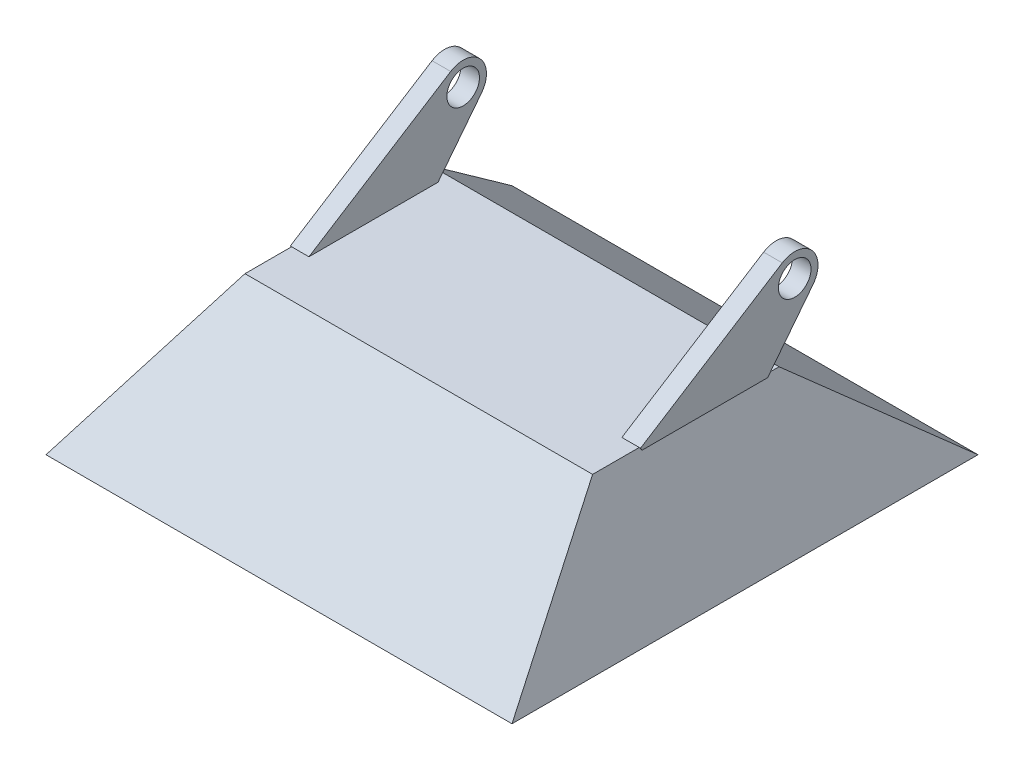
ISO-10303-21;
HEADER;
FILE_DESCRIPTION(('STEP AP214'),'2;1');
FILE_NAME('part.step','',(''),(''),'','','');
FILE_SCHEMA(('AUTOMOTIVE_DESIGN { 1 0 10303 214 1 1 1 1 }'));
ENDSEC;
DATA;
#1=APPLICATION_CONTEXT('core data for automotive mechanical design processes');
#2=APPLICATION_PROTOCOL_DEFINITION('international standard','automotive_design',2000,#1);
#3=PRODUCT_CONTEXT('',#1,'mechanical');
#4=PRODUCT('Part','Part','',(#3));
#5=PRODUCT_RELATED_PRODUCT_CATEGORY('part','',(#4));
#6=PRODUCT_DEFINITION_FORMATION('','',#4);
#7=PRODUCT_DEFINITION_CONTEXT('part definition',#1,'design');
#8=PRODUCT_DEFINITION('design','',#6,#7);
#9=PRODUCT_DEFINITION_SHAPE('','',#8);
#10=(LENGTH_UNIT() NAMED_UNIT(*) SI_UNIT(.MILLI.,.METRE.));
#11=(NAMED_UNIT(*) PLANE_ANGLE_UNIT() SI_UNIT($,.RADIAN.));
#12=(NAMED_UNIT(*) SI_UNIT($,.STERADIAN.) SOLID_ANGLE_UNIT());
#13=UNCERTAINTY_MEASURE_WITH_UNIT(LENGTH_MEASURE(1.E-05),#10,'distance_accuracy_value','');
#14=(GEOMETRIC_REPRESENTATION_CONTEXT(3) GLOBAL_UNCERTAINTY_ASSIGNED_CONTEXT((#13)) GLOBAL_UNIT_ASSIGNED_CONTEXT((#10,
#11,#12)) REPRESENTATION_CONTEXT('',''));
#15=CARTESIAN_POINT('',(0.,0.,0.));
#16=DIRECTION('',(0.,0.,1.));
#17=DIRECTION('',(1.,0.,0.));
#18=AXIS2_PLACEMENT_3D('',#15,#16,#17);
#19=CARTESIAN_POINT('',(0.,125.,0.));
#20=DIRECTION('',(0.,1.,0.));
#21=DIRECTION('',(0.,0.,1.));
#22=AXIS2_PLACEMENT_3D('',#19,#20,#21);
#23=PLANE('',#22);
#24=DIRECTION('',(1.,0.,0.));
#25=VECTOR('',#24,1.);
#26=CARTESIAN_POINT('',(-187.87,125.,50.));
#27=LINE('',#26,#25);
#28=CARTESIAN_POINT('',(-186.5,125.,50.));
#29=VERTEX_POINT('',#28);
#30=CARTESIAN_POINT('',(-167.87,125.,50.));
#31=VERTEX_POINT('',#30);
#32=EDGE_CURVE('E159',#29,#31,#27,.T.);
#33=ORIENTED_EDGE('',*,*,#32,.F.);
#34=DIRECTION('',(0.,0.,1.));
#35=VECTOR('',#34,1.);
#36=CARTESIAN_POINT('',(-186.5,125.,100.));
#37=LINE('',#36,#35);
#38=CARTESIAN_POINT('',(-186.5,125.,100.));
#39=VERTEX_POINT('',#38);
#40=EDGE_CURVE('E239',#29,#39,#37,.T.);
#41=ORIENTED_EDGE('',*,*,#40,.T.);
#42=DIRECTION('',(1.,0.,0.));
#43=VECTOR('',#42,1.);
#44=CARTESIAN_POINT('',(186.5,125.,100.));
#45=LINE('',#44,#43);
#46=CARTESIAN_POINT('',(186.5,125.,100.));
#47=VERTEX_POINT('',#46);
#48=EDGE_CURVE('E247',#39,#47,#45,.T.);
#49=ORIENTED_EDGE('',*,*,#48,.T.);
#50=DIRECTION('',(0.,0.,-1.));
#51=VECTOR('',#50,1.);
#52=CARTESIAN_POINT('',(186.5,125.,100.));
#53=LINE('',#52,#51);
#54=CARTESIAN_POINT('',(186.5,125.,50.));
#55=VERTEX_POINT('',#54);
#56=EDGE_CURVE('E363',#47,#55,#53,.T.);
#57=ORIENTED_EDGE('',*,*,#56,.T.);
#58=DIRECTION('',(-1.,0.,0.));
#59=VECTOR('',#58,1.);
#60=CARTESIAN_POINT('',(187.87,125.,50.));
#61=LINE('',#60,#59);
#62=CARTESIAN_POINT('',(167.87,125.,50.));
#63=VERTEX_POINT('',#62);
#64=EDGE_CURVE('E213',#55,#63,#61,.T.);
#65=ORIENTED_EDGE('',*,*,#64,.T.);
#66=DIRECTION('',(0.,0.,-1.));
#67=VECTOR('',#66,1.);
#68=CARTESIAN_POINT('',(167.87,125.,0.));
#69=LINE('',#68,#67);
#70=CARTESIAN_POINT('',(167.87,125.,-88.5027876048742));
#71=VERTEX_POINT('',#70);
#72=EDGE_CURVE('E359',#63,#71,#69,.T.);
#73=ORIENTED_EDGE('',*,*,#72,.T.);
#74=DIRECTION('',(1.,0.,0.));
#75=VECTOR('',#74,1.);
#76=CARTESIAN_POINT('',(0.,125.,-88.5027876048742));
#77=LINE('',#76,#75);
#78=CARTESIAN_POINT('',(186.5,125.,-88.5027876048742));
#79=VERTEX_POINT('',#78);
#80=EDGE_CURVE('E230',#71,#79,#77,.T.);
#81=ORIENTED_EDGE('',*,*,#80,.T.);
#82=CARTESIAN_POINT('',(186.5,125.,-100.));
#83=VERTEX_POINT('',#82);
#84=EDGE_CURVE('E345',#79,#83,#53,.T.);
#85=ORIENTED_EDGE('',*,*,#84,.T.);
#86=DIRECTION('',(-1.,0.,0.));
#87=VECTOR('',#86,1.);
#88=CARTESIAN_POINT('',(186.5,125.,-100.));
#89=LINE('',#88,#87);
#90=CARTESIAN_POINT('',(-186.5,125.,-100.));
#91=VERTEX_POINT('',#90);
#92=EDGE_CURVE('E402',#83,#91,#89,.T.);
#93=ORIENTED_EDGE('',*,*,#92,.T.);
#94=CARTESIAN_POINT('',(-186.5,125.,-88.5027876048742));
#95=VERTEX_POINT('',#94);
#96=EDGE_CURVE('E409',#91,#95,#37,.T.);
#97=ORIENTED_EDGE('',*,*,#96,.T.);
#98=DIRECTION('',(-1.,0.,0.));
#99=VECTOR('',#98,1.);
#100=CARTESIAN_POINT('',(0.,125.,-88.5027876048742));
#101=LINE('',#100,#99);
#102=CARTESIAN_POINT('',(-167.87,125.,-88.5027876048742));
#103=VERTEX_POINT('',#102);
#104=EDGE_CURVE('E66',#103,#95,#101,.T.);
#105=ORIENTED_EDGE('',*,*,#104,.F.);
#106=DIRECTION('',(0.,0.,1.));
#107=VECTOR('',#106,1.);
#108=CARTESIAN_POINT('',(-167.87,125.,0.));
#109=LINE('',#108,#107);
#110=EDGE_CURVE('E12',#103,#31,#109,.T.);
#111=ORIENTED_EDGE('',*,*,#110,.T.);
#112=EDGE_LOOP('',(#33,#41,#49,#57,#65,#73,#81,#85,#93,#97,#105,#111));
#113=FACE_BOUND('',#112,.T.);
#114=ADVANCED_FACE('F45',(#113),#23,.T.);
#115=CARTESIAN_POINT('',(198.718030243294,100.948759363594,0.));
#116=DIRECTION('',(0.891556011125032,0.452910453651516,0.));
#117=DIRECTION('',(-0.452910453651516,0.891556011125032,0.));
#118=AXIS2_PLACEMENT_3D('',#115,#116,#117);
#119=PLANE('',#118);
#120=DIRECTION('',(0.,0.,-1.));
#121=VECTOR('',#120,1.);
#122=CARTESIAN_POINT('',(187.87,122.303149606299,0.));
#123=LINE('',#122,#121);
#124=CARTESIAN_POINT('',(187.87,122.303149606299,48.2956394986172));
#125=VERTEX_POINT('',#124);
#126=CARTESIAN_POINT('',(187.87,122.303149606299,-86.3914195744424));
#127=VERTEX_POINT('',#126);
#128=EDGE_CURVE('E349',#125,#127,#123,.T.);
#129=ORIENTED_EDGE('',*,*,#128,.F.);
#130=DIRECTION('',(-0.394585862863372,0.776743824534196,0.490887999319964));
#131=VECTOR('',#130,1.);
#132=CARTESIAN_POINT('',(205.45871217599,87.6797004409636,26.4142480366118));
#133=LINE('',#132,#131);
#134=EDGE_CURVE('E355',#125,#55,#133,.T.);
#135=ORIENTED_EDGE('',*,*,#134,.T.);
#136=ORIENTED_EDGE('',*,*,#56,.F.);
#137=DIRECTION('',(0.309269853533616,-0.608798924278772,0.730558709134526));
#138=VECTOR('',#137,1.);
#139=CARTESIAN_POINT('',(186.5,125.,100.));
#140=LINE('',#139,#138);
#141=CARTESIAN_POINT('',(250.,0.,250.));
#142=VERTEX_POINT('',#141);
#143=EDGE_CURVE('E453',#47,#142,#140,.T.);
#144=ORIENTED_EDGE('',*,*,#143,.T.);
#145=DIRECTION('',(0.,0.,-1.));
#146=VECTOR('',#145,1.);
#147=CARTESIAN_POINT('',(250.,0.,250.));
#148=LINE('',#147,#146);
#149=CARTESIAN_POINT('',(250.,0.,-250.));
#150=VERTEX_POINT('',#149);
#151=EDGE_CURVE('E315',#142,#150,#148,.T.);
#152=ORIENTED_EDGE('',*,*,#151,.T.);
#153=DIRECTION('',(0.309269853533616,-0.608798924278772,-0.730558709134526));
#154=VECTOR('',#153,1.);
#155=CARTESIAN_POINT('',(186.5,125.,-100.));
#156=LINE('',#155,#154);
#157=EDGE_CURVE('E447',#83,#150,#156,.T.);
#158=ORIENTED_EDGE('',*,*,#157,.F.);
#159=ORIENTED_EDGE('',*,*,#84,.F.);
#160=DIRECTION('',(0.371387237398304,-0.73107723897304,0.572361416024187));
#161=VECTOR('',#160,1.);
#162=CARTESIAN_POINT('',(213.52826919963,71.7947456700198,-46.8483178924647));
#163=LINE('',#162,#161);
#164=EDGE_CURVE('E352',#79,#127,#163,.T.);
#165=ORIENTED_EDGE('',*,*,#164,.T.);
#166=EDGE_LOOP('',(#129,#135,#136,#144,#152,#158,#159,#165));
#167=FACE_BOUND('',#166,.T.);
#168=ADVANCED_FACE('F321',(#167),#119,.T.);
#169=CARTESIAN_POINT('',(0.,0.,0.));
#170=DIRECTION('',(0.,1.,0.));
#171=DIRECTION('',(0.,0.,1.));
#172=AXIS2_PLACEMENT_3D('',#169,#170,#171);
#173=PLANE('',#172);
#174=CARTESIAN_POINT('',(0.,0.,0.));
#175=DIRECTION('',(0.,-1.,0.));
#176=DIRECTION('',(0.,0.,-1.));
#177=AXIS2_PLACEMENT_3D('',#174,#175,#176);
#178=CIRCLE('',#177,137.5);
#179=CARTESIAN_POINT('',(0.,0.,-137.5));
#180=VERTEX_POINT('',#179);
#181=EDGE_CURVE('E232',#180,#180,#178,.T.);
#182=ORIENTED_EDGE('',*,*,#181,.F.);
#183=EDGE_LOOP('',(#182));
#184=FACE_BOUND('',#183,.T.);
#185=DIRECTION('',(0.,0.,1.));
#186=VECTOR('',#185,1.);
#187=CARTESIAN_POINT('',(-250.,0.,250.));
#188=LINE('',#187,#186);
#189=CARTESIAN_POINT('',(-250.,0.,-250.));
#190=VERTEX_POINT('',#189);
#191=CARTESIAN_POINT('',(-250.,0.,250.));
#192=VERTEX_POINT('',#191);
#193=EDGE_CURVE('E288',#190,#192,#188,.T.);
#194=ORIENTED_EDGE('',*,*,#193,.F.);
#195=DIRECTION('',(-1.,0.,0.));
#196=VECTOR('',#195,1.);
#197=CARTESIAN_POINT('',(250.,0.,-250.));
#198=LINE('',#197,#196);
#199=EDGE_CURVE('E302',#150,#190,#198,.T.);
#200=ORIENTED_EDGE('',*,*,#199,.F.);
#201=ORIENTED_EDGE('',*,*,#151,.F.);
#202=DIRECTION('',(1.,0.,0.));
#203=VECTOR('',#202,1.);
#204=CARTESIAN_POINT('',(250.,0.,250.));
#205=LINE('',#204,#203);
#206=EDGE_CURVE('E353',#192,#142,#205,.T.);
#207=ORIENTED_EDGE('',*,*,#206,.F.);
#208=EDGE_LOOP('',(#194,#200,#201,#207));
#209=FACE_BOUND('',#208,.T.);
#210=ADVANCED_FACE('F47',(#184,#209),#173,.F.);
#211=CARTESIAN_POINT('',(-198.718030243295,100.948759363594,0.));
#212=DIRECTION('',(-0.891556011125032,0.452910453651516,0.));
#213=DIRECTION('',(-0.452910453651516,-0.891556011125032,0.));
#214=AXIS2_PLACEMENT_3D('',#211,#212,#213);
#215=PLANE('',#214);
#216=DIRECTION('',(0.394585862863371,0.776743824534197,0.490887999319965));
#217=VECTOR('',#216,1.);
#218=CARTESIAN_POINT('',(-205.458712175991,87.6797004409635,26.4142480366117));
#219=LINE('',#218,#217);
#220=CARTESIAN_POINT('',(-187.87,122.303149606299,48.2956394986174));
#221=VERTEX_POINT('',#220);
#222=EDGE_CURVE('E55',#221,#29,#219,.T.);
#223=ORIENTED_EDGE('',*,*,#222,.F.);
#224=DIRECTION('',(0.,0.,1.));
#225=VECTOR('',#224,1.);
#226=CARTESIAN_POINT('',(-187.87,122.303149606299,0.));
#227=LINE('',#226,#225);
#228=CARTESIAN_POINT('',(-187.87,122.303149606299,-86.3914195744426));
#229=VERTEX_POINT('',#228);
#230=EDGE_CURVE('E169',#229,#221,#227,.T.);
#231=ORIENTED_EDGE('',*,*,#230,.F.);
#232=DIRECTION('',(-0.371387237398304,-0.73107723897304,0.572361416024187));
#233=VECTOR('',#232,1.);
#234=CARTESIAN_POINT('',(-213.52826919963,71.7947456700197,-46.8483178924646));
#235=LINE('',#234,#233);
#236=EDGE_CURVE('E701',#95,#229,#235,.T.);
#237=ORIENTED_EDGE('',*,*,#236,.F.);
#238=ORIENTED_EDGE('',*,*,#96,.F.);
#239=DIRECTION('',(-0.309269853533616,-0.608798924278772,-0.730558709134527));
#240=VECTOR('',#239,1.);
#241=CARTESIAN_POINT('',(-186.5,125.,-100.));
#242=LINE('',#241,#240);
#243=EDGE_CURVE('E376',#91,#190,#242,.T.);
#244=ORIENTED_EDGE('',*,*,#243,.T.);
#245=ORIENTED_EDGE('',*,*,#193,.T.);
#246=DIRECTION('',(-0.309269853533616,-0.608798924278772,0.730558709134526));
#247=VECTOR('',#246,1.);
#248=CARTESIAN_POINT('',(-186.5,125.,100.));
#249=LINE('',#248,#247);
#250=EDGE_CURVE('E252',#39,#192,#249,.T.);
#251=ORIENTED_EDGE('',*,*,#250,.F.);
#252=ORIENTED_EDGE('',*,*,#40,.F.);
#253=EDGE_LOOP('',(#223,#231,#237,#238,#244,#245,#251,#252));
#254=FACE_BOUND('',#253,.T.);
#255=ADVANCED_FACE('F265',(#254),#215,.T.);
#256=CARTESIAN_POINT('',(0.,122.950819672131,102.459016393443));
#257=DIRECTION('',(0.,0.768221279597376,0.64018439966448));
#258=DIRECTION('',(0.,-0.64018439966448,0.768221279597376));
#259=AXIS2_PLACEMENT_3D('',#256,#257,#258);
#260=PLANE('',#259);
#261=ORIENTED_EDGE('',*,*,#250,.T.);
#262=ORIENTED_EDGE('',*,*,#206,.T.);
#263=ORIENTED_EDGE('',*,*,#143,.F.);
#264=ORIENTED_EDGE('',*,*,#48,.F.);
#265=EDGE_LOOP('',(#261,#262,#263,#264));
#266=FACE_BOUND('',#265,.T.);
#267=ADVANCED_FACE('F254',(#266),#260,.T.);
#268=CARTESIAN_POINT('',(0.,122.950819672131,-102.459016393443));
#269=DIRECTION('',(0.,0.768221279597376,-0.64018439966448));
#270=DIRECTION('',(0.,0.64018439966448,0.768221279597376));
#271=AXIS2_PLACEMENT_3D('',#268,#269,#270);
#272=PLANE('',#271);
#273=ORIENTED_EDGE('',*,*,#157,.T.);
#274=ORIENTED_EDGE('',*,*,#199,.T.);
#275=ORIENTED_EDGE('',*,*,#243,.F.);
#276=ORIENTED_EDGE('',*,*,#92,.F.);
#277=EDGE_LOOP('',(#273,#274,#275,#276));
#278=FACE_BOUND('',#277,.T.);
#279=ADVANCED_FACE('F264',(#278),#272,.T.);
#280=CARTESIAN_POINT('',(0.,20.,0.));
#281=DIRECTION('',(0.,-1.,0.));
#282=DIRECTION('',(0.,0.,-1.));
#283=AXIS2_PLACEMENT_3D('',#280,#281,#282);
#284=CYLINDRICAL_SURFACE('',#283,137.5);
#285=CARTESIAN_POINT('',(0.,20.,0.));
#286=DIRECTION('',(0.,-1.,0.));
#287=DIRECTION('',(0.,0.,-1.));
#288=AXIS2_PLACEMENT_3D('',#285,#286,#287);
#289=CIRCLE('',#288,137.5);
#290=CARTESIAN_POINT('',(0.,20.,-137.5));
#291=VERTEX_POINT('',#290);
#292=EDGE_CURVE('E236',#291,#291,#289,.T.);
#293=ORIENTED_EDGE('',*,*,#292,.F.);
#294=EDGE_LOOP('',(#293));
#295=FACE_BOUND('',#294,.T.);
#296=ORIENTED_EDGE('',*,*,#181,.T.);
#297=EDGE_LOOP('',(#296));
#298=FACE_BOUND('',#297,.T.);
#299=ADVANCED_FACE('F392',(#295,#298),#284,.F.);
#300=CARTESIAN_POINT('',(0.,20.,0.));
#301=DIRECTION('',(0.,-1.,0.));
#302=DIRECTION('',(0.,0.,-1.));
#303=AXIS2_PLACEMENT_3D('',#300,#301,#302);
#304=PLANE('',#303);
#305=ORIENTED_EDGE('',*,*,#292,.T.);
#306=EDGE_LOOP('',(#305));
#307=FACE_BOUND('',#306,.T.);
#308=ADVANCED_FACE('F511',(#307),#304,.T.);
#309=CARTESIAN_POINT('',(187.87,125.,50.));
#310=DIRECTION('',(0.,0.534236438985632,-0.845335097615112));
#311=DIRECTION('',(0.,0.845335097615112,0.534236438985632));
#312=AXIS2_PLACEMENT_3D('',#309,#310,#311);
#313=PLANE('',#312);
#314=ORIENTED_EDGE('',*,*,#134,.F.);
#315=DIRECTION('',(0.,-0.845335097615112,-0.534236438985632));
#316=VECTOR('',#315,1.);
#317=CARTESIAN_POINT('',(187.87,125.,50.));
#318=LINE('',#317,#316);
#319=CARTESIAN_POINT('',(187.87,125.,50.));
#320=VERTEX_POINT('',#319);
#321=EDGE_CURVE('E203',#320,#125,#318,.T.);
#322=ORIENTED_EDGE('',*,*,#321,.F.);
#323=EDGE_CURVE('E227',#320,#55,#61,.T.);
#324=ORIENTED_EDGE('',*,*,#323,.T.);
#325=EDGE_LOOP('',(#314,#322,#324));
#326=FACE_BOUND('',#325,.T.);
#327=ADVANCED_FACE('F517',(#326),#313,.F.);
#328=CARTESIAN_POINT('',(187.87,184.588720059745,-135.154881767147));
#329=DIRECTION('',(0.,0.616451197610199,0.787393117168896));
#330=DIRECTION('',(0.,-0.787393117168896,0.616451197610199));
#331=AXIS2_PLACEMENT_3D('',#328,#329,#330);
#332=PLANE('',#331);
#333=ORIENTED_EDGE('',*,*,#80,.F.);
#334=DIRECTION('',(0.,0.787393117168896,-0.616451197610199));
#335=VECTOR('',#334,1.);
#336=CARTESIAN_POINT('',(167.87,184.588720059745,-135.154881767147));
#337=LINE('',#336,#335);
#338=CARTESIAN_POINT('',(167.87,184.588720059745,-135.154881767147));
#339=VERTEX_POINT('',#338);
#340=EDGE_CURVE('E214',#71,#339,#337,.T.);
#341=ORIENTED_EDGE('',*,*,#340,.T.);
#342=DIRECTION('',(-1.,0.,0.));
#343=VECTOR('',#342,1.);
#344=CARTESIAN_POINT('',(187.87,184.588720059745,-135.154881767147));
#345=LINE('',#344,#343);
#346=CARTESIAN_POINT('',(187.87,184.588720059745,-135.154881767147));
#347=VERTEX_POINT('',#346);
#348=EDGE_CURVE('E233',#347,#339,#345,.T.);
#349=ORIENTED_EDGE('',*,*,#348,.F.);
#350=DIRECTION('',(0.,0.787393117168896,-0.616451197610199));
#351=VECTOR('',#350,1.);
#352=CARTESIAN_POINT('',(187.87,184.588720059745,-135.154881767147));
#353=LINE('',#352,#351);
#354=EDGE_CURVE('E206',#127,#347,#353,.T.);
#355=ORIENTED_EDGE('',*,*,#354,.F.);
#356=ORIENTED_EDGE('',*,*,#164,.F.);
#357=EDGE_LOOP('',(#333,#341,#349,#355,#356));
#358=FACE_BOUND('',#357,.T.);
#359=ADVANCED_FACE('F562',(#358),#332,.F.);
#360=CARTESIAN_POINT('',(187.87,200.,-115.470053837924));
#361=DIRECTION('',(-1.,0.,0.));
#362=DIRECTION('',(0.,0.,1.));
#363=AXIS2_PLACEMENT_3D('',#360,#361,#362);
#364=CYLINDRICAL_SURFACE('',#363,25.);
#365=CARTESIAN_POINT('',(167.87,200.,-115.470053837924));
#366=DIRECTION('',(1.,0.,0.));
#367=DIRECTION('',(0.,0.,-1.));
#368=AXIS2_PLACEMENT_3D('',#365,#366,#367);
#369=CIRCLE('',#368,25.);
#370=CARTESIAN_POINT('',(167.87,221.133377440378,-102.114142863284));
#371=VERTEX_POINT('',#370);
#372=EDGE_CURVE('E216',#339,#371,#369,.T.);
#373=ORIENTED_EDGE('',*,*,#372,.T.);
#374=DIRECTION('',(-1.,0.,0.));
#375=VECTOR('',#374,1.);
#376=CARTESIAN_POINT('',(187.87,221.133377440378,-102.114142863284));
#377=LINE('',#376,#375);
#378=CARTESIAN_POINT('',(187.87,221.133377440378,-102.114142863284));
#379=VERTEX_POINT('',#378);
#380=EDGE_CURVE('E222',#379,#371,#377,.T.);
#381=ORIENTED_EDGE('',*,*,#380,.F.);
#382=CARTESIAN_POINT('',(187.87,200.,-115.470053837924));
#383=DIRECTION('',(1.,0.,0.));
#384=DIRECTION('',(0.,0.,-1.));
#385=AXIS2_PLACEMENT_3D('',#382,#383,#384);
#386=CIRCLE('',#385,25.);
#387=EDGE_CURVE('E209',#347,#379,#386,.T.);
#388=ORIENTED_EDGE('',*,*,#387,.F.);
#389=ORIENTED_EDGE('',*,*,#348,.T.);
#390=EDGE_LOOP('',(#373,#381,#388,#389));
#391=FACE_BOUND('',#390,.T.);
#392=ADVANCED_FACE('F571',(#391),#364,.T.);
#393=CARTESIAN_POINT('',(187.87,221.133377440378,-102.114142863284));
#394=DIRECTION('',(0.,-0.845335097615112,-0.534236438985631));
#395=DIRECTION('',(0.,0.534236438985631,-0.845335097615113));
#396=AXIS2_PLACEMENT_3D('',#393,#394,#395);
#397=PLANE('',#396);
#398=DIRECTION('',(0.,-0.534236438985631,0.845335097615112));
#399=VECTOR('',#398,1.);
#400=CARTESIAN_POINT('',(167.87,221.133377440378,-102.114142863284));
#401=LINE('',#400,#399);
#402=EDGE_CURVE('E207',#371,#63,#401,.T.);
#403=ORIENTED_EDGE('',*,*,#402,.T.);
#404=ORIENTED_EDGE('',*,*,#64,.F.);
#405=ORIENTED_EDGE('',*,*,#323,.F.);
#406=DIRECTION('',(0.,-0.534236438985631,0.845335097615112));
#407=VECTOR('',#406,1.);
#408=CARTESIAN_POINT('',(187.87,221.133377440378,-102.114142863284));
#409=LINE('',#408,#407);
#410=EDGE_CURVE('E211',#379,#320,#409,.T.);
#411=ORIENTED_EDGE('',*,*,#410,.F.);
#412=ORIENTED_EDGE('',*,*,#380,.T.);
#413=EDGE_LOOP('',(#403,#404,#405,#411,#412));
#414=FACE_BOUND('',#413,.T.);
#415=ADVANCED_FACE('F580',(#414),#397,.F.);
#416=CARTESIAN_POINT('',(187.87,200.,-115.470053837924));
#417=DIRECTION('',(1.,0.,0.));
#418=DIRECTION('',(0.,0.,-1.));
#419=AXIS2_PLACEMENT_3D('',#416,#417,#418);
#420=PLANE('',#419);
#421=CARTESIAN_POINT('',(187.87,200.,-115.470053837924));
#422=DIRECTION('',(1.,0.,0.));
#423=DIRECTION('',(0.,0.,-1.));
#424=AXIS2_PLACEMENT_3D('',#421,#422,#423);
#425=CIRCLE('',#424,17.5);
#426=CARTESIAN_POINT('',(187.87,200.,-132.970053837924));
#427=VERTEX_POINT('',#426);
#428=EDGE_CURVE('E199',#427,#427,#425,.T.);
#429=ORIENTED_EDGE('',*,*,#428,.F.);
#430=EDGE_LOOP('',(#429));
#431=FACE_BOUND('',#430,.T.);
#432=ORIENTED_EDGE('',*,*,#321,.T.);
#433=ORIENTED_EDGE('',*,*,#128,.T.);
#434=ORIENTED_EDGE('',*,*,#354,.T.);
#435=ORIENTED_EDGE('',*,*,#387,.T.);
#436=ORIENTED_EDGE('',*,*,#410,.T.);
#437=EDGE_LOOP('',(#432,#433,#434,#435,#436));
#438=FACE_BOUND('',#437,.T.);
#439=ADVANCED_FACE('F589',(#431,#438),#420,.T.);
#440=CARTESIAN_POINT('',(167.87,200.,-115.470053837924));
#441=DIRECTION('',(1.,0.,0.));
#442=DIRECTION('',(0.,0.,-1.));
#443=AXIS2_PLACEMENT_3D('',#440,#441,#442);
#444=PLANE('',#443);
#445=CARTESIAN_POINT('',(167.87,200.,-115.470053837924));
#446=DIRECTION('',(1.,0.,0.));
#447=DIRECTION('',(0.,0.,-1.));
#448=AXIS2_PLACEMENT_3D('',#445,#446,#447);
#449=CIRCLE('',#448,17.5);
#450=CARTESIAN_POINT('',(167.87,200.,-132.970053837924));
#451=VERTEX_POINT('',#450);
#452=EDGE_CURVE('E202',#451,#451,#449,.T.);
#453=ORIENTED_EDGE('',*,*,#452,.T.);
#454=EDGE_LOOP('',(#453));
#455=FACE_BOUND('',#454,.T.);
#456=ORIENTED_EDGE('',*,*,#72,.F.);
#457=ORIENTED_EDGE('',*,*,#402,.F.);
#458=ORIENTED_EDGE('',*,*,#372,.F.);
#459=ORIENTED_EDGE('',*,*,#340,.F.);
#460=EDGE_LOOP('',(#456,#457,#458,#459));
#461=FACE_BOUND('',#460,.T.);
#462=ADVANCED_FACE('F598',(#455,#461),#444,.F.);
#463=CARTESIAN_POINT('',(-250.0001,200.,-115.470053837924));
#464=DIRECTION('',(1.,0.,0.));
#465=DIRECTION('',(0.,0.,-1.));
#466=AXIS2_PLACEMENT_3D('',#463,#464,#465);
#467=CYLINDRICAL_SURFACE('',#466,17.5);
#468=ORIENTED_EDGE('',*,*,#428,.T.);
#469=EDGE_LOOP('',(#468));
#470=FACE_BOUND('',#469,.T.);
#471=ORIENTED_EDGE('',*,*,#452,.F.);
#472=EDGE_LOOP('',(#471));
#473=FACE_BOUND('',#472,.T.);
#474=ADVANCED_FACE('F607',(#470,#473),#467,.F.);
#475=CARTESIAN_POINT('',(-187.87,125.,50.));
#476=DIRECTION('',(0.,-0.534236438985632,0.845335097615112));
#477=DIRECTION('',(0.,-0.845335097615112,-0.534236438985632));
#478=AXIS2_PLACEMENT_3D('',#475,#476,#477);
#479=PLANE('',#478);
#480=DIRECTION('',(0.,-0.845335097615112,-0.534236438985632));
#481=VECTOR('',#480,1.);
#482=CARTESIAN_POINT('',(-187.87,125.,50.));
#483=LINE('',#482,#481);
#484=CARTESIAN_POINT('',(-187.87,125.,50.));
#485=VERTEX_POINT('',#484);
#486=EDGE_CURVE('E156',#485,#221,#483,.T.);
#487=ORIENTED_EDGE('',*,*,#486,.T.);
#488=ORIENTED_EDGE('',*,*,#222,.T.);
#489=EDGE_CURVE('E153',#485,#29,#27,.T.);
#490=ORIENTED_EDGE('',*,*,#489,.F.);
#491=EDGE_LOOP('',(#487,#488,#490));
#492=FACE_BOUND('',#491,.T.);
#493=ADVANCED_FACE('F155',(#492),#479,.T.);
#494=CARTESIAN_POINT('',(-187.87,221.133377440378,-102.114142863284));
#495=DIRECTION('',(0.,0.845335097615112,0.534236438985631));
#496=DIRECTION('',(0.,-0.534236438985631,0.845335097615113));
#497=AXIS2_PLACEMENT_3D('',#494,#495,#496);
#498=PLANE('',#497);
#499=DIRECTION('',(0.,-0.534236438985631,0.845335097615112));
#500=VECTOR('',#499,1.);
#501=CARTESIAN_POINT('',(-167.87,221.133377440378,-102.114142863284));
#502=LINE('',#501,#500);
#503=CARTESIAN_POINT('',(-167.87,221.133377440378,-102.114142863284));
#504=VERTEX_POINT('',#503);
#505=EDGE_CURVE('E183',#504,#31,#502,.T.);
#506=ORIENTED_EDGE('',*,*,#505,.F.);
#507=DIRECTION('',(1.,0.,0.));
#508=VECTOR('',#507,1.);
#509=CARTESIAN_POINT('',(-187.87,221.133377440378,-102.114142863284));
#510=LINE('',#509,#508);
#511=CARTESIAN_POINT('',(-187.87,221.133377440378,-102.114142863284));
#512=VERTEX_POINT('',#511);
#513=EDGE_CURVE('E174',#512,#504,#510,.T.);
#514=ORIENTED_EDGE('',*,*,#513,.F.);
#515=DIRECTION('',(0.,-0.534236438985631,0.845335097615112));
#516=VECTOR('',#515,1.);
#517=CARTESIAN_POINT('',(-187.87,221.133377440378,-102.114142863284));
#518=LINE('',#517,#516);
#519=EDGE_CURVE('E167',#512,#485,#518,.T.);
#520=ORIENTED_EDGE('',*,*,#519,.T.);
#521=ORIENTED_EDGE('',*,*,#489,.T.);
#522=ORIENTED_EDGE('',*,*,#32,.T.);
#523=EDGE_LOOP('',(#506,#514,#520,#521,#522));
#524=FACE_BOUND('',#523,.T.);
#525=ADVANCED_FACE('F173',(#524),#498,.T.);
#526=CARTESIAN_POINT('',(-187.87,200.,-115.470053837924));
#527=DIRECTION('',(1.,0.,0.));
#528=DIRECTION('',(0.,0.,-1.));
#529=AXIS2_PLACEMENT_3D('',#526,#527,#528);
#530=CYLINDRICAL_SURFACE('',#529,25.);
#531=CARTESIAN_POINT('',(-167.87,200.,-115.470053837924));
#532=DIRECTION('',(1.,0.,0.));
#533=DIRECTION('',(0.,0.,-1.));
#534=AXIS2_PLACEMENT_3D('',#531,#532,#533);
#535=CIRCLE('',#534,25.);
#536=CARTESIAN_POINT('',(-167.87,184.588720059745,-135.154881767147));
#537=VERTEX_POINT('',#536);
#538=EDGE_CURVE('E186',#537,#504,#535,.T.);
#539=ORIENTED_EDGE('',*,*,#538,.F.);
#540=DIRECTION('',(1.,0.,0.));
#541=VECTOR('',#540,1.);
#542=CARTESIAN_POINT('',(-187.87,184.588720059745,-135.154881767147));
#543=LINE('',#542,#541);
#544=CARTESIAN_POINT('',(-187.87,184.588720059745,-135.154881767147));
#545=VERTEX_POINT('',#544);
#546=EDGE_CURVE('E182',#545,#537,#543,.T.);
#547=ORIENTED_EDGE('',*,*,#546,.F.);
#548=CARTESIAN_POINT('',(-187.87,200.,-115.470053837924));
#549=DIRECTION('',(1.,0.,0.));
#550=DIRECTION('',(0.,0.,-1.));
#551=AXIS2_PLACEMENT_3D('',#548,#549,#550);
#552=CIRCLE('',#551,25.);
#553=EDGE_CURVE('E175',#545,#512,#552,.T.);
#554=ORIENTED_EDGE('',*,*,#553,.T.);
#555=ORIENTED_EDGE('',*,*,#513,.T.);
#556=EDGE_LOOP('',(#539,#547,#554,#555));
#557=FACE_BOUND('',#556,.T.);
#558=ADVANCED_FACE('F630',(#557),#530,.T.);
#559=CARTESIAN_POINT('',(-187.87,184.588720059745,-135.154881767147));
#560=DIRECTION('',(0.,-0.616451197610199,-0.787393117168896));
#561=DIRECTION('',(0.,0.787393117168896,-0.616451197610199));
#562=AXIS2_PLACEMENT_3D('',#559,#560,#561);
#563=PLANE('',#562);
#564=DIRECTION('',(0.,0.787393117168896,-0.616451197610199));
#565=VECTOR('',#564,1.);
#566=CARTESIAN_POINT('',(-167.87,184.588720059745,-135.154881767147));
#567=LINE('',#566,#565);
#568=EDGE_CURVE('E170',#103,#537,#567,.T.);
#569=ORIENTED_EDGE('',*,*,#568,.F.);
#570=ORIENTED_EDGE('',*,*,#104,.T.);
#571=ORIENTED_EDGE('',*,*,#236,.T.);
#572=DIRECTION('',(0.,0.787393117168896,-0.616451197610199));
#573=VECTOR('',#572,1.);
#574=CARTESIAN_POINT('',(-187.87,184.588720059745,-135.154881767147));
#575=LINE('',#574,#573);
#576=EDGE_CURVE('E177',#229,#545,#575,.T.);
#577=ORIENTED_EDGE('',*,*,#576,.T.);
#578=ORIENTED_EDGE('',*,*,#546,.T.);
#579=EDGE_LOOP('',(#569,#570,#571,#577,#578));
#580=FACE_BOUND('',#579,.T.);
#581=ADVANCED_FACE('F638',(#580),#563,.T.);
#582=CARTESIAN_POINT('',(-187.87,200.,-115.470053837924));
#583=DIRECTION('',(-1.,0.,0.));
#584=DIRECTION('',(0.,0.,-1.));
#585=AXIS2_PLACEMENT_3D('',#582,#583,#584);
#586=PLANE('',#585);
#587=CARTESIAN_POINT('',(-187.87,200.,-115.470053837924));
#588=DIRECTION('',(1.,0.,0.));
#589=DIRECTION('',(0.,0.,-1.));
#590=AXIS2_PLACEMENT_3D('',#587,#588,#589);
#591=CIRCLE('',#590,17.5);
#592=CARTESIAN_POINT('',(-187.87,200.,-132.970053837924));
#593=VERTEX_POINT('',#592);
#594=EDGE_CURVE('E693',#593,#593,#591,.T.);
#595=ORIENTED_EDGE('',*,*,#594,.T.);
#596=EDGE_LOOP('',(#595));
#597=FACE_BOUND('',#596,.T.);
#598=ORIENTED_EDGE('',*,*,#576,.F.);
#599=ORIENTED_EDGE('',*,*,#230,.T.);
#600=ORIENTED_EDGE('',*,*,#486,.F.);
#601=ORIENTED_EDGE('',*,*,#519,.F.);
#602=ORIENTED_EDGE('',*,*,#553,.F.);
#603=EDGE_LOOP('',(#598,#599,#600,#601,#602));
#604=FACE_BOUND('',#603,.T.);
#605=ADVANCED_FACE('F165',(#597,#604),#586,.T.);
#606=CARTESIAN_POINT('',(-167.87,200.,-115.470053837924));
#607=DIRECTION('',(-1.,0.,0.));
#608=DIRECTION('',(0.,0.,-1.));
#609=AXIS2_PLACEMENT_3D('',#606,#607,#608);
#610=PLANE('',#609);
#611=CARTESIAN_POINT('',(-167.87,200.,-115.470053837924));
#612=DIRECTION('',(-1.,0.,0.));
#613=DIRECTION('',(0.,0.,1.));
#614=AXIS2_PLACEMENT_3D('',#611,#612,#613);
#615=CIRCLE('',#614,17.5);
#616=CARTESIAN_POINT('',(-167.87,200.,-97.9700538379244));
#617=VERTEX_POINT('',#616);
#618=EDGE_CURVE('E50',#617,#617,#615,.F.);
#619=ORIENTED_EDGE('',*,*,#618,.F.);
#620=EDGE_LOOP('',(#619));
#621=FACE_BOUND('',#620,.T.);
#622=ORIENTED_EDGE('',*,*,#110,.F.);
#623=ORIENTED_EDGE('',*,*,#568,.T.);
#624=ORIENTED_EDGE('',*,*,#538,.T.);
#625=ORIENTED_EDGE('',*,*,#505,.T.);
#626=EDGE_LOOP('',(#622,#623,#624,#625));
#627=FACE_BOUND('',#626,.T.);
#628=ADVANCED_FACE('F655',(#621,#627),#610,.F.);
#629=CARTESIAN_POINT('',(250.0001,200.,-115.470053837924));
#630=DIRECTION('',(-1.,0.,0.));
#631=DIRECTION('',(0.,0.,1.));
#632=AXIS2_PLACEMENT_3D('',#629,#630,#631);
#633=CYLINDRICAL_SURFACE('',#632,17.5);
#634=ORIENTED_EDGE('',*,*,#594,.F.);
#635=EDGE_LOOP('',(#634));
#636=FACE_BOUND('',#635,.T.);
#637=ORIENTED_EDGE('',*,*,#618,.T.);
#638=EDGE_LOOP('',(#637));
#639=FACE_BOUND('',#638,.T.);
#640=ADVANCED_FACE('F664',(#636,#639),#633,.F.);
#641=CLOSED_SHELL('',(#114,#168,#210,#255,#267,#279,#299,#308,#327,#359,#392,#415,#439,#462,
#474,#493,#525,#558,#581,#605,#628,#640));
#642=MANIFOLD_SOLID_BREP('B2',#641);
#643=ADVANCED_BREP_SHAPE_REPRESENTATION('',(#18,#642),#14);
#644=SHAPE_DEFINITION_REPRESENTATION(#9,#643);
ENDSEC;
END-ISO-10303-21;
